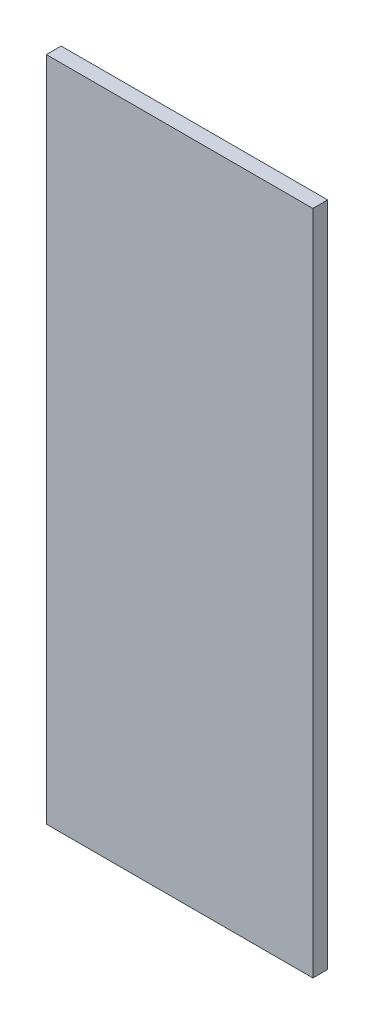
ISO-10303-21;
HEADER;
FILE_DESCRIPTION(('STEP AP214'),'2;1');
FILE_NAME('part.step','',(''),(''),'','','');
FILE_SCHEMA(('AUTOMOTIVE_DESIGN { 1 0 10303 214 1 1 1 1 }'));
ENDSEC;
DATA;
#1=APPLICATION_CONTEXT('core data for automotive mechanical design processes');
#2=APPLICATION_PROTOCOL_DEFINITION('international standard','automotive_design',2000,#1);
#3=PRODUCT_CONTEXT('',#1,'mechanical');
#4=PRODUCT('Part','Part','',(#3));
#5=PRODUCT_RELATED_PRODUCT_CATEGORY('part','',(#4));
#6=PRODUCT_DEFINITION_FORMATION('','',#4);
#7=PRODUCT_DEFINITION_CONTEXT('part definition',#1,'design');
#8=PRODUCT_DEFINITION('design','',#6,#7);
#9=PRODUCT_DEFINITION_SHAPE('','',#8);
#10=(LENGTH_UNIT() NAMED_UNIT(*) SI_UNIT(.MILLI.,.METRE.));
#11=(NAMED_UNIT(*) PLANE_ANGLE_UNIT() SI_UNIT($,.RADIAN.));
#12=(NAMED_UNIT(*) SI_UNIT($,.STERADIAN.) SOLID_ANGLE_UNIT());
#13=UNCERTAINTY_MEASURE_WITH_UNIT(LENGTH_MEASURE(1.E-05),#10,'distance_accuracy_value','');
#14=(GEOMETRIC_REPRESENTATION_CONTEXT(3) GLOBAL_UNCERTAINTY_ASSIGNED_CONTEXT((#13)) GLOBAL_UNIT_ASSIGNED_CONTEXT((#10,
#11,#12)) REPRESENTATION_CONTEXT('',''));
#15=CARTESIAN_POINT('',(0.,0.,0.));
#16=DIRECTION('',(0.,0.,1.));
#17=DIRECTION('',(1.,0.,0.));
#18=AXIS2_PLACEMENT_3D('',#15,#16,#17);
#19=CARTESIAN_POINT('',(57.15,142.8745,6.35));
#20=DIRECTION('',(-1.,0.,0.));
#21=DIRECTION('',(0.,-1.,0.));
#22=AXIS2_PLACEMENT_3D('',#19,#20,#21);
#23=PLANE('',#22);
#24=DIRECTION('',(0.,1.,0.));
#25=VECTOR('',#24,1.);
#26=CARTESIAN_POINT('',(57.15,142.8745,0.));
#27=LINE('',#26,#25);
#28=CARTESIAN_POINT('',(57.15,-142.8745,0.));
#29=VERTEX_POINT('',#28);
#30=CARTESIAN_POINT('',(57.15,142.8745,0.));
#31=VERTEX_POINT('',#30);
#32=EDGE_CURVE('E96',#29,#31,#27,.T.);
#33=ORIENTED_EDGE('',*,*,#32,.T.);
#34=DIRECTION('',(0.,0.,-1.));
#35=VECTOR('',#34,1.);
#36=CARTESIAN_POINT('',(57.15,142.8745,6.35));
#37=LINE('',#36,#35);
#38=CARTESIAN_POINT('',(57.15,142.8745,6.35));
#39=VERTEX_POINT('',#38);
#40=EDGE_CURVE('E11',#39,#31,#37,.T.);
#41=ORIENTED_EDGE('',*,*,#40,.F.);
#42=DIRECTION('',(0.,1.,0.));
#43=VECTOR('',#42,1.);
#44=CARTESIAN_POINT('',(57.15,142.8745,6.35));
#45=LINE('',#44,#43);
#46=CARTESIAN_POINT('',(57.15,-142.8745,6.35));
#47=VERTEX_POINT('',#46);
#48=EDGE_CURVE('E84',#47,#39,#45,.T.);
#49=ORIENTED_EDGE('',*,*,#48,.F.);
#50=DIRECTION('',(0.,0.,-1.));
#51=VECTOR('',#50,1.);
#52=CARTESIAN_POINT('',(57.15,-142.8745,6.35));
#53=LINE('',#52,#51);
#54=EDGE_CURVE('E92',#47,#29,#53,.T.);
#55=ORIENTED_EDGE('',*,*,#54,.T.);
#56=EDGE_LOOP('',(#33,#41,#49,#55));
#57=FACE_BOUND('',#56,.T.);
#58=ADVANCED_FACE('F33',(#57),#23,.F.);
#59=CARTESIAN_POINT('',(-57.15,142.8745,6.35));
#60=DIRECTION('',(0.,-1.,0.));
#61=DIRECTION('',(0.,0.,-1.));
#62=AXIS2_PLACEMENT_3D('',#59,#60,#61);
#63=PLANE('',#62);
#64=DIRECTION('',(-1.,0.,0.));
#65=VECTOR('',#64,1.);
#66=CARTESIAN_POINT('',(-57.15,142.8745,0.));
#67=LINE('',#66,#65);
#68=CARTESIAN_POINT('',(-57.15,142.8745,0.));
#69=VERTEX_POINT('',#68);
#70=EDGE_CURVE('E88',#31,#69,#67,.T.);
#71=ORIENTED_EDGE('',*,*,#70,.T.);
#72=DIRECTION('',(0.,0.,-1.));
#73=VECTOR('',#72,1.);
#74=CARTESIAN_POINT('',(-57.15,142.8745,6.35));
#75=LINE('',#74,#73);
#76=CARTESIAN_POINT('',(-57.15,142.8745,6.35));
#77=VERTEX_POINT('',#76);
#78=EDGE_CURVE('E41',#77,#69,#75,.T.);
#79=ORIENTED_EDGE('',*,*,#78,.F.);
#80=DIRECTION('',(-1.,0.,0.));
#81=VECTOR('',#80,1.);
#82=CARTESIAN_POINT('',(-57.15,142.8745,6.35));
#83=LINE('',#82,#81);
#84=EDGE_CURVE('E79',#39,#77,#83,.T.);
#85=ORIENTED_EDGE('',*,*,#84,.F.);
#86=ORIENTED_EDGE('',*,*,#40,.T.);
#87=EDGE_LOOP('',(#71,#79,#85,#86));
#88=FACE_BOUND('',#87,.T.);
#89=ADVANCED_FACE('F87',(#88),#63,.F.);
#90=CARTESIAN_POINT('',(-57.15,142.8745,6.35));
#91=DIRECTION('',(1.,0.,0.));
#92=DIRECTION('',(0.,1.,0.));
#93=AXIS2_PLACEMENT_3D('',#90,#91,#92);
#94=PLANE('',#93);
#95=DIRECTION('',(0.,-1.,0.));
#96=VECTOR('',#95,1.);
#97=CARTESIAN_POINT('',(-57.15,142.8745,0.));
#98=LINE('',#97,#96);
#99=CARTESIAN_POINT('',(-57.15,-142.8745,0.));
#100=VERTEX_POINT('',#99);
#101=EDGE_CURVE('E66',#69,#100,#98,.T.);
#102=ORIENTED_EDGE('',*,*,#101,.T.);
#103=DIRECTION('',(0.,0.,-1.));
#104=VECTOR('',#103,1.);
#105=CARTESIAN_POINT('',(-57.15,-142.8745,6.35));
#106=LINE('',#105,#104);
#107=CARTESIAN_POINT('',(-57.15,-142.8745,6.35));
#108=VERTEX_POINT('',#107);
#109=EDGE_CURVE('E89',#108,#100,#106,.T.);
#110=ORIENTED_EDGE('',*,*,#109,.F.);
#111=DIRECTION('',(0.,-1.,0.));
#112=VECTOR('',#111,1.);
#113=CARTESIAN_POINT('',(-57.15,142.8745,6.35));
#114=LINE('',#113,#112);
#115=EDGE_CURVE('E82',#77,#108,#114,.T.);
#116=ORIENTED_EDGE('',*,*,#115,.F.);
#117=ORIENTED_EDGE('',*,*,#78,.T.);
#118=EDGE_LOOP('',(#102,#110,#116,#117));
#119=FACE_BOUND('',#118,.T.);
#120=ADVANCED_FACE('F90',(#119),#94,.F.);
#121=CARTESIAN_POINT('',(-57.15,-142.8745,6.35));
#122=DIRECTION('',(0.,1.,0.));
#123=DIRECTION('',(0.,0.,1.));
#124=AXIS2_PLACEMENT_3D('',#121,#122,#123);
#125=PLANE('',#124);
#126=DIRECTION('',(1.,0.,0.));
#127=VECTOR('',#126,1.);
#128=CARTESIAN_POINT('',(-57.15,-142.8745,0.));
#129=LINE('',#128,#127);
#130=EDGE_CURVE('E72',#100,#29,#129,.T.);
#131=ORIENTED_EDGE('',*,*,#130,.T.);
#132=ORIENTED_EDGE('',*,*,#54,.F.);
#133=DIRECTION('',(1.,0.,0.));
#134=VECTOR('',#133,1.);
#135=CARTESIAN_POINT('',(-57.15,-142.8745,6.35));
#136=LINE('',#135,#134);
#137=EDGE_CURVE('E49',#108,#47,#136,.T.);
#138=ORIENTED_EDGE('',*,*,#137,.F.);
#139=ORIENTED_EDGE('',*,*,#109,.T.);
#140=EDGE_LOOP('',(#131,#132,#138,#139));
#141=FACE_BOUND('',#140,.T.);
#142=ADVANCED_FACE('F103',(#141),#125,.F.);
#143=CARTESIAN_POINT('',(0.,0.,6.35));
#144=DIRECTION('',(0.,0.,1.));
#145=DIRECTION('',(1.,0.,0.));
#146=AXIS2_PLACEMENT_3D('',#143,#144,#145);
#147=PLANE('',#146);
#148=ORIENTED_EDGE('',*,*,#48,.T.);
#149=ORIENTED_EDGE('',*,*,#84,.T.);
#150=ORIENTED_EDGE('',*,*,#115,.T.);
#151=ORIENTED_EDGE('',*,*,#137,.T.);
#152=EDGE_LOOP('',(#148,#149,#150,#151));
#153=FACE_BOUND('',#152,.T.);
#154=ADVANCED_FACE('F80',(#153),#147,.T.);
#155=CARTESIAN_POINT('',(0.,0.,0.));
#156=DIRECTION('',(0.,0.,1.));
#157=DIRECTION('',(1.,0.,0.));
#158=AXIS2_PLACEMENT_3D('',#155,#156,#157);
#159=PLANE('',#158);
#160=ORIENTED_EDGE('',*,*,#32,.F.);
#161=ORIENTED_EDGE('',*,*,#130,.F.);
#162=ORIENTED_EDGE('',*,*,#101,.F.);
#163=ORIENTED_EDGE('',*,*,#70,.F.);
#164=EDGE_LOOP('',(#160,#161,#162,#163));
#165=FACE_BOUND('',#164,.T.);
#166=ADVANCED_FACE('F106',(#165),#159,.F.);
#167=CLOSED_SHELL('',(#58,#89,#120,#142,#154,#166));
#168=MANIFOLD_SOLID_BREP('B2',#167);
#169=ADVANCED_BREP_SHAPE_REPRESENTATION('',(#18,#168),#14);
#170=SHAPE_DEFINITION_REPRESENTATION(#9,#169);
ENDSEC;
END-ISO-10303-21;
